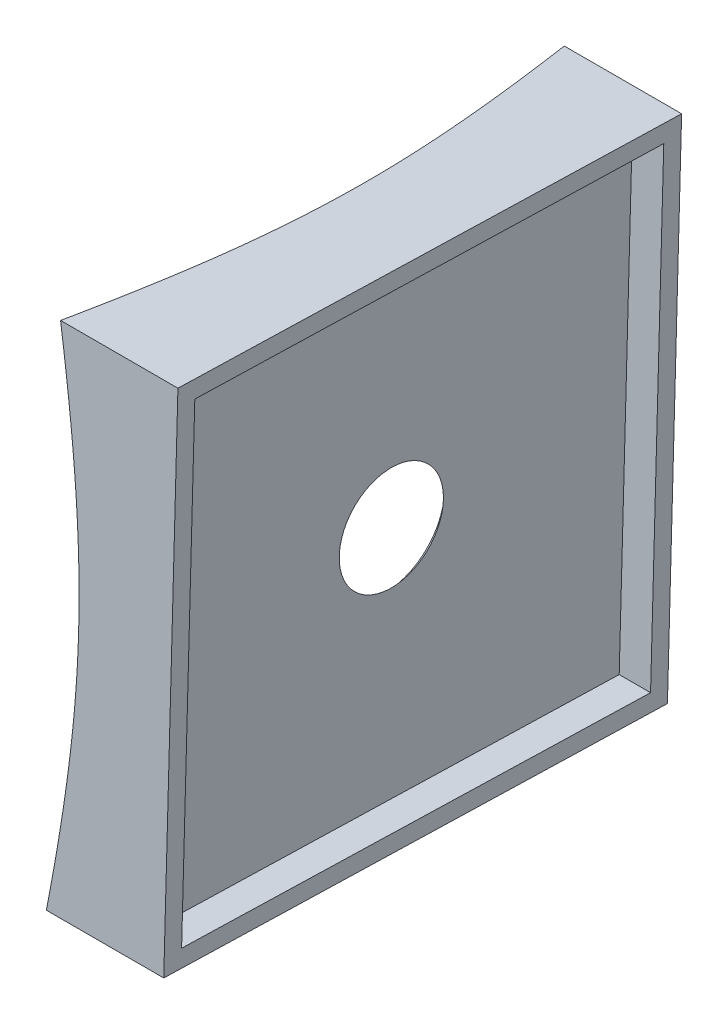
ISO-10303-21;
HEADER;
FILE_DESCRIPTION(('STEP AP214'),'2;1');
FILE_NAME('part.step','',(''),(''),'','','');
FILE_SCHEMA(('AUTOMOTIVE_DESIGN { 1 0 10303 214 1 1 1 1 }'));
ENDSEC;
DATA;
#1=APPLICATION_CONTEXT('core data for automotive mechanical design processes');
#2=APPLICATION_PROTOCOL_DEFINITION('international standard','automotive_design',2000,#1);
#3=PRODUCT_CONTEXT('',#1,'mechanical');
#4=PRODUCT('Part','Part','',(#3));
#5=PRODUCT_RELATED_PRODUCT_CATEGORY('part','',(#4));
#6=PRODUCT_DEFINITION_FORMATION('','',#4);
#7=PRODUCT_DEFINITION_CONTEXT('part definition',#1,'design');
#8=PRODUCT_DEFINITION('design','',#6,#7);
#9=PRODUCT_DEFINITION_SHAPE('','',#8);
#10=(LENGTH_UNIT() NAMED_UNIT(*) SI_UNIT(.MILLI.,.METRE.));
#11=(NAMED_UNIT(*) PLANE_ANGLE_UNIT() SI_UNIT($,.RADIAN.));
#12=(NAMED_UNIT(*) SI_UNIT($,.STERADIAN.) SOLID_ANGLE_UNIT());
#13=UNCERTAINTY_MEASURE_WITH_UNIT(LENGTH_MEASURE(1.E-05),#10,'distance_accuracy_value','');
#14=(GEOMETRIC_REPRESENTATION_CONTEXT(3) GLOBAL_UNCERTAINTY_ASSIGNED_CONTEXT((#13)) GLOBAL_UNIT_ASSIGNED_CONTEXT((#10,
#11,#12)) REPRESENTATION_CONTEXT('',''));
#15=CARTESIAN_POINT('',(0.,0.,0.));
#16=DIRECTION('',(0.,0.,1.));
#17=DIRECTION('',(1.,0.,0.));
#18=AXIS2_PLACEMENT_3D('',#15,#16,#17);
#19=CARTESIAN_POINT('',(-15.,0.,0.));
#20=DIRECTION('',(1.,0.,0.));
#21=DIRECTION('',(0.,0.,-1.));
#22=AXIS2_PLACEMENT_3D('',#19,#20,#21);
#23=PLANE('',#22);
#24=DIRECTION('',(0.,-0.999603331238634,0.0281634546287368));
#25=VECTOR('',#24,1.);
#26=CARTESIAN_POINT('',(-15.,-50.420133833359,8.76548214453563));
#27=LINE('',#26,#25);
#28=CARTESIAN_POINT('',(-15.,7.5568593784818,7.13200177606889));
#29=VERTEX_POINT('',#28);
#30=CARTESIAN_POINT('',(-15.,-50.420133833359,8.76548214453563));
#31=VERTEX_POINT('',#30);
#32=EDGE_CURVE('E131',#29,#31,#27,.T.);
#33=ORIENTED_EDGE('',*,*,#32,.T.);
#34=DIRECTION('',(0.,-0.0281634546287368,-0.999603331238634));
#35=VECTOR('',#34,1.);
#36=CARTESIAN_POINT('',(-15.,-52.0536142018258,-49.2115110673052));
#37=LINE('',#36,#35);
#38=CARTESIAN_POINT('',(-15.,-52.0536142018258,-49.2115110673052));
#39=VERTEX_POINT('',#38);
#40=EDGE_CURVE('E135',#31,#39,#37,.T.);
#41=ORIENTED_EDGE('',*,*,#40,.T.);
#42=DIRECTION('',(0.,0.999603331238634,-0.0281634546287367));
#43=VECTOR('',#42,1.);
#44=CARTESIAN_POINT('',(-15.,5.92337901001507,-50.8449914357719));
#45=LINE('',#44,#43);
#46=CARTESIAN_POINT('',(-15.,5.92337901001507,-50.8449914357719));
#47=VERTEX_POINT('',#46);
#48=EDGE_CURVE('E115',#39,#47,#45,.T.);
#49=ORIENTED_EDGE('',*,*,#48,.T.);
#50=DIRECTION('',(0.,0.0281634546287368,0.999603331238634));
#51=VECTOR('',#50,1.);
#52=CARTESIAN_POINT('',(-15.,7.5568593784818,7.13200177606889));
#53=LINE('',#52,#51);
#54=EDGE_CURVE('E125',#47,#29,#53,.T.);
#55=ORIENTED_EDGE('',*,*,#54,.T.);
#56=EDGE_LOOP('',(#33,#41,#49,#55));
#57=FACE_BOUND('',#56,.T.);
#58=DIRECTION('',(0.,0.0281634546287368,0.999603331238634));
#59=VECTOR('',#58,1.);
#60=CARTESIAN_POINT('',(-15.,5.50132580674706,5.1891220228491));
#61=LINE('',#60,#59);
#62=CARTESIAN_POINT('',(-15.,3.98049925679527,-48.7894578640372));
#63=VERTEX_POINT('',#62);
#64=CARTESIAN_POINT('',(-15.,5.50132580674706,5.1891220228491));
#65=VERTEX_POINT('',#64);
#66=EDGE_CURVE('E228',#63,#65,#61,.T.);
#67=ORIENTED_EDGE('',*,*,#66,.F.);
#68=DIRECTION('',(0.,0.999603331238634,-0.0281634546287368));
#69=VECTOR('',#68,1.);
#70=CARTESIAN_POINT('',(-15.,3.98049925679527,-48.7894578640372));
#71=LINE('',#70,#69);
#72=CARTESIAN_POINT('',(-15.,-49.998080630091,-47.2686313140854));
#73=VERTEX_POINT('',#72);
#74=EDGE_CURVE('E225',#73,#63,#71,.T.);
#75=ORIENTED_EDGE('',*,*,#74,.F.);
#76=DIRECTION('',(0.,-0.028163454628737,-0.999603331238634));
#77=VECTOR('',#76,1.);
#78=CARTESIAN_POINT('',(-15.,-49.998080630091,-47.2686313140854));
#79=LINE('',#78,#77);
#80=CARTESIAN_POINT('',(-15.,-48.4772540801392,6.70994857280088));
#81=VERTEX_POINT('',#80);
#82=EDGE_CURVE('E222',#81,#73,#79,.T.);
#83=ORIENTED_EDGE('',*,*,#82,.F.);
#84=DIRECTION('',(0.,-0.999603331238634,0.0281634546287368));
#85=VECTOR('',#84,1.);
#86=CARTESIAN_POINT('',(-15.,-48.4772540801392,6.70994857280088));
#87=LINE('',#86,#85);
#88=EDGE_CURVE('E219',#65,#81,#87,.T.);
#89=ORIENTED_EDGE('',*,*,#88,.F.);
#90=EDGE_LOOP('',(#67,#75,#83,#89));
#91=FACE_BOUND('',#90,.T.);
#92=ADVANCED_FACE('F45',(#57,#91),#23,.T.);
#93=CARTESIAN_POINT('',(-11.4581699793895,-22.248377411672,-21.0397546456181));
#94=DIRECTION('',(1.,0.,0.));
#95=DIRECTION('',(0.,0.,-1.));
#96=AXIS2_PLACEMENT_3D('',#93,#94,#95);
#97=TOROIDAL_SURFACE('',#96,12.9893724579747,10.);
#98=CARTESIAN_POINT('',(-18.61,-22.248377411672,-21.0397546456181));
#99=DIRECTION('',(1.,0.,0.));
#100=DIRECTION('',(0.,0.,-1.));
#101=AXIS2_PLACEMENT_3D('',#98,#99,#100);
#102=CIRCLE('',#101,6.);
#103=CARTESIAN_POINT('',(-18.61,-22.248377411672,-27.0397546456181));
#104=VERTEX_POINT('',#103);
#105=EDGE_CURVE('E181',#104,#104,#102,.T.);
#106=ORIENTED_EDGE('',*,*,#105,.T.);
#107=EDGE_LOOP('',(#106));
#108=FACE_BOUND('',#107,.T.);
#109=CARTESIAN_POINT('',(-21.1789920651224,-22.248377411672,-21.0397546456181));
#110=DIRECTION('',(-1.,0.,0.));
#111=DIRECTION('',(0.,0.,1.));
#112=AXIS2_PLACEMENT_3D('',#109,#110,#111);
#113=CIRCLE('',#112,10.6429671269357);
#114=CARTESIAN_POINT('',(-21.1789920651224,-22.248377411672,-10.3967875186824));
#115=VERTEX_POINT('',#114);
#116=EDGE_CURVE('E142',#115,#115,#113,.F.);
#117=ORIENTED_EDGE('',*,*,#116,.F.);
#118=EDGE_LOOP('',(#117));
#119=FACE_BOUND('',#118,.T.);
#120=ADVANCED_FACE('F250',(#108,#119),#97,.T.);
#121=CARTESIAN_POINT('',(-18.61,3.98049925679527,-48.7894578640372));
#122=DIRECTION('',(0.,0.0281634546287368,0.999603331238634));
#123=DIRECTION('',(0.,-0.999603331238634,0.0281634546287368));
#124=AXIS2_PLACEMENT_3D('',#121,#122,#123);
#125=PLANE('',#124);
#126=DIRECTION('',(1.,0.,0.));
#127=VECTOR('',#126,1.);
#128=CARTESIAN_POINT('',(-18.61,-49.998080630091,-47.2686313140854));
#129=LINE('',#128,#127);
#130=CARTESIAN_POINT('',(-18.61,-49.998080630091,-47.2686313140854));
#131=VERTEX_POINT('',#130);
#132=EDGE_CURVE('E151',#131,#73,#129,.T.);
#133=ORIENTED_EDGE('',*,*,#132,.T.);
#134=ORIENTED_EDGE('',*,*,#74,.T.);
#135=DIRECTION('',(1.,0.,0.));
#136=VECTOR('',#135,1.);
#137=CARTESIAN_POINT('',(-18.61,3.98049925679527,-48.7894578640372));
#138=LINE('',#137,#136);
#139=CARTESIAN_POINT('',(-18.61,3.98049925679527,-48.7894578640372));
#140=VERTEX_POINT('',#139);
#141=EDGE_CURVE('E147',#140,#63,#138,.T.);
#142=ORIENTED_EDGE('',*,*,#141,.F.);
#143=DIRECTION('',(0.,-0.999603331238634,0.0281634546287368));
#144=VECTOR('',#143,1.);
#145=CARTESIAN_POINT('',(-18.61,3.98049925679527,-48.7894578640372));
#146=LINE('',#145,#144);
#147=EDGE_CURVE('E170',#140,#131,#146,.T.);
#148=ORIENTED_EDGE('',*,*,#147,.T.);
#149=EDGE_LOOP('',(#133,#134,#142,#148));
#150=FACE_BOUND('',#149,.T.);
#151=ADVANCED_FACE('F252',(#150),#125,.T.);
#152=CARTESIAN_POINT('',(-18.61,-51.2368740175924,-20.2230144613848));
#153=DIRECTION('',(1.,0.,0.));
#154=DIRECTION('',(0.,0.,-1.));
#155=AXIS2_PLACEMENT_3D('',#152,#153,#154);
#156=PLANE('',#155);
#157=ORIENTED_EDGE('',*,*,#105,.F.);
#158=EDGE_LOOP('',(#157));
#159=FACE_BOUND('',#158,.T.);
#160=ORIENTED_EDGE('',*,*,#147,.F.);
#161=DIRECTION('',(0.,-0.0281634546287368,-0.999603331238634));
#162=VECTOR('',#161,1.);
#163=CARTESIAN_POINT('',(-18.61,5.50132580674706,5.1891220228491));
#164=LINE('',#163,#162);
#165=CARTESIAN_POINT('',(-18.61,5.50132580674706,5.1891220228491));
#166=VERTEX_POINT('',#165);
#167=EDGE_CURVE('E177',#166,#140,#164,.T.);
#168=ORIENTED_EDGE('',*,*,#167,.F.);
#169=DIRECTION('',(0.,0.999603331238634,-0.0281634546287368));
#170=VECTOR('',#169,1.);
#171=CARTESIAN_POINT('',(-18.61,-48.4772540801392,6.70994857280088));
#172=LINE('',#171,#170);
#173=CARTESIAN_POINT('',(-18.61,-48.4772540801392,6.70994857280088));
#174=VERTEX_POINT('',#173);
#175=EDGE_CURVE('E162',#174,#166,#172,.T.);
#176=ORIENTED_EDGE('',*,*,#175,.F.);
#177=DIRECTION('',(0.,0.028163454628737,0.999603331238634));
#178=VECTOR('',#177,1.);
#179=CARTESIAN_POINT('',(-18.61,-49.998080630091,-47.2686313140854));
#180=LINE('',#179,#178);
#181=EDGE_CURVE('E167',#131,#174,#180,.T.);
#182=ORIENTED_EDGE('',*,*,#181,.F.);
#183=EDGE_LOOP('',(#160,#168,#176,#182));
#184=FACE_BOUND('',#183,.T.);
#185=ADVANCED_FACE('F206',(#159,#184),#156,.T.);
#186=CARTESIAN_POINT('',(-18.61,-49.998080630091,-47.2686313140854));
#187=DIRECTION('',(0.,0.999603331238634,-0.028163454628737));
#188=DIRECTION('',(0.,0.028163454628737,0.999603331238634));
#189=AXIS2_PLACEMENT_3D('',#186,#187,#188);
#190=PLANE('',#189);
#191=DIRECTION('',(1.,0.,0.));
#192=VECTOR('',#191,1.);
#193=CARTESIAN_POINT('',(-18.61,-48.4772540801392,6.70994857280088));
#194=LINE('',#193,#192);
#195=EDGE_CURVE('E154',#174,#81,#194,.T.);
#196=ORIENTED_EDGE('',*,*,#195,.T.);
#197=ORIENTED_EDGE('',*,*,#82,.T.);
#198=ORIENTED_EDGE('',*,*,#132,.F.);
#199=ORIENTED_EDGE('',*,*,#181,.T.);
#200=EDGE_LOOP('',(#196,#197,#198,#199));
#201=FACE_BOUND('',#200,.T.);
#202=ADVANCED_FACE('F268',(#201),#190,.T.);
#203=CARTESIAN_POINT('',(-18.61,5.50132580674706,5.1891220228491));
#204=DIRECTION('',(0.,-0.999603331238634,0.0281634546287368));
#205=DIRECTION('',(0.,-0.0281634546287368,-0.999603331238634));
#206=AXIS2_PLACEMENT_3D('',#203,#204,#205);
#207=PLANE('',#206);
#208=ORIENTED_EDGE('',*,*,#141,.T.);
#209=ORIENTED_EDGE('',*,*,#66,.T.);
#210=DIRECTION('',(1.,0.,0.));
#211=VECTOR('',#210,1.);
#212=CARTESIAN_POINT('',(-18.61,5.50132580674706,5.1891220228491));
#213=LINE('',#212,#211);
#214=EDGE_CURVE('E49',#166,#65,#213,.T.);
#215=ORIENTED_EDGE('',*,*,#214,.F.);
#216=ORIENTED_EDGE('',*,*,#167,.T.);
#217=EDGE_LOOP('',(#208,#209,#215,#216));
#218=FACE_BOUND('',#217,.T.);
#219=ADVANCED_FACE('F272',(#218),#207,.T.);
#220=CARTESIAN_POINT('',(-18.61,-48.4772540801392,6.70994857280088));
#221=DIRECTION('',(0.,-0.0281634546287368,-0.999603331238634));
#222=DIRECTION('',(0.,0.999603331238634,-0.0281634546287368));
#223=AXIS2_PLACEMENT_3D('',#220,#221,#222);
#224=PLANE('',#223);
#225=ORIENTED_EDGE('',*,*,#214,.T.);
#226=ORIENTED_EDGE('',*,*,#88,.T.);
#227=ORIENTED_EDGE('',*,*,#195,.F.);
#228=ORIENTED_EDGE('',*,*,#175,.T.);
#229=EDGE_LOOP('',(#225,#226,#227,#228));
#230=FACE_BOUND('',#229,.T.);
#231=ADVANCED_FACE('F47',(#230),#224,.T.);
#232=CARTESIAN_POINT('',(-18.61,-50.420133833359,8.76548214453563));
#233=DIRECTION('',(0.,-0.0281634546287368,-0.999603331238634));
#234=DIRECTION('',(0.,0.999603331238634,-0.0281634546287368));
#235=AXIS2_PLACEMENT_3D('',#232,#233,#234);
#236=PLANE('',#235);
#237=ORIENTED_EDGE('',*,*,#32,.F.);
#238=DIRECTION('',(1.,0.,0.));
#239=VECTOR('',#238,1.);
#240=CARTESIAN_POINT('',(-18.61,7.5568593784818,7.13200177606889));
#241=LINE('',#240,#239);
#242=CARTESIAN_POINT('',(-28.5094949366117,7.5568593784818,7.13200177606889));
#243=VERTEX_POINT('',#242);
#244=EDGE_CURVE('E122',#243,#29,#241,.T.);
#245=ORIENTED_EDGE('',*,*,#244,.F.);
#246=CARTESIAN_POINT('',(-28.5095290864061,-50.420333833359,8.76548777946175));
#247=CARTESIAN_POINT('',(-28.3615120189373,-49.5533192105682,8.74105996271852));
#248=CARTESIAN_POINT('',(-28.2166725597,-48.6857525699901,8.71661659307804));
#249=CARTESIAN_POINT('',(-27.9344218695929,-46.9493810106497,8.66769496576661));
#250=CARTESIAN_POINT('',(-27.7970109167125,-46.0805760467939,8.64321670682519));
#251=CARTESIAN_POINT('',(-27.5306322784443,-44.3412065444453,8.59421061357687));
#252=CARTESIAN_POINT('',(-27.4016690184003,-43.4706413261291,8.56968276011622));
#253=CARTESIAN_POINT('',(-27.1535275015908,-41.7281219349922,8.52058791991479));
#254=CARTESIAN_POINT('',(-27.034349156175,-40.8561677748282,8.49602093353061));
#255=CARTESIAN_POINT('',(-26.8070554140274,-39.1099534307571,8.44682198939508));
#256=CARTESIAN_POINT('',(-26.6989508607805,-38.2356918304129,8.42218999173614));
#257=CARTESIAN_POINT('',(-26.4954430895225,-36.4856747589599,8.37288390716127));
#258=CARTESIAN_POINT('',(-26.4000400225253,-35.609919270215,8.34820981974844));
#259=CARTESIAN_POINT('',(-26.2235172089076,-33.8570926198621,8.29882457632585));
#260=CARTESIAN_POINT('',(-26.1423953660181,-32.9800216704369,8.27411342629425));
#261=CARTESIAN_POINT('',(-25.9959661704289,-31.2245756977996,8.22465438443381));
#262=CARTESIAN_POINT('',(-25.9306584035643,-30.3462007093461,8.19990649358427));
#263=CARTESIAN_POINT('',(-25.8179691541409,-28.5991859282428,8.15068499743102));
#264=CARTESIAN_POINT('',(-25.7703762731965,-27.7305598556457,8.12621177868473));
#265=CARTESIAN_POINT('',(-25.6931071834216,-25.9925067195989,8.07724277357074));
#266=CARTESIAN_POINT('',(-25.6634309447749,-25.1230796574847,8.05274698724067));
#267=CARTESIAN_POINT('',(-25.6227405676756,-23.3837759019233,8.0037427463838));
#268=CARTESIAN_POINT('',(-25.611726637473,-22.5138992035671,7.9792342917187));
#269=CARTESIAN_POINT('',(-25.6086490462998,-20.774112940722,7.93021645639734));
#270=CARTESIAN_POINT('',(-25.616585364688,-19.90420337627,7.90570707574212));
#271=CARTESIAN_POINT('',(-25.6511860596537,-18.1654805771054,7.85671920311714));
#272=CARTESIAN_POINT('',(-25.6778349183791,-17.2966670311303,7.83224070237767));
#273=CARTESIAN_POINT('',(-25.7491698861546,-15.5597813464223,7.78330458977393));
#274=CARTESIAN_POINT('',(-25.7938560930921,-14.6917092117386,7.75884697802373));
#275=CARTESIAN_POINT('',(-25.9002067407894,-12.956622360095,7.70996154687713));
#276=CARTESIAN_POINT('',(-25.961870998212,-12.0896076318182,7.68553372716187));
#277=CARTESIAN_POINT('',(-26.1008527747968,-10.3568322122462,7.63671341976009));
#278=CARTESIAN_POINT('',(-26.1781704302152,-9.49107153193292,7.61232093238299));
#279=CARTESIAN_POINT('',(-26.3285324181474,-7.95006618876275,7.56890367604869));
#280=CARTESIAN_POINT('',(-26.3988156007163,-7.27454974925753,7.5498712498848));
#281=CARTESIAN_POINT('',(-26.5473173293966,-5.92443325905969,7.51183221647334));
#282=CARTESIAN_POINT('',(-26.625535405659,-5.24983315650227,7.49282560776449));
#283=CARTESIAN_POINT('',(-26.8710401613971,-3.22719997339546,7.43583866494146));
#284=CARTESIAN_POINT('',(-27.0491636728229,-1.88047138809848,7.39789508449917));
#285=CARTESIAN_POINT('',(-27.3345557694149,0.140619093372598,7.34095160672489));
#286=CARTESIAN_POINT('',(-27.4330029283504,0.816253373573036,7.32191586044295));
#287=CARTESIAN_POINT('',(-27.6352741600994,2.16671936948047,7.28386697983721));
#288=CARTESIAN_POINT('',(-27.739098225591,2.84155108627906,7.26485384548267));
#289=CARTESIAN_POINT('',(-27.9515363580887,4.19024344984259,7.22685493631309));
#290=CARTESIAN_POINT('',(-28.0601489294023,4.86410433288063,7.20786915484115));
#291=CARTESIAN_POINT('',(-28.2817087806571,6.21110705670203,7.16991785064719));
#292=CARTESIAN_POINT('',(-28.3946560157991,6.88424890484283,7.15095232771789));
#293=CARTESIAN_POINT('',(-28.5095290864061,7.55705937848181,7.13199614114277));
#294=B_SPLINE_CURVE_WITH_KNOTS('',3,(#246,#247,#248,#249,#250,#251,#252,#253,#254,#255,#256,
#257,#258,#259,#260,#261,#262,#263,#264,#265,#266,#267,#268,#269,#270,#271,#272,#273,#274,#275,
#276,#277,#278,#279,#280,#281,#282,#283,#284,#285,#286,#287,#288,#289,#290,#291,#292,#293),
.UNSPECIFIED.,.F.,.F.,(4,2,2,2,2,2,2,2,2,2,2,2,2,2,2,2,2,2,2,2,2,2,2,4),(0.,2.63970211740469,
5.2795029493581,7.92067576715604,10.5618246535933,13.205535522218,15.8492778203558,
18.4926317327186,21.1359164091373,23.7465614329058,26.357202112124,28.9678719228976,
31.5785388900533,34.1870434478219,36.7955621619664,39.4040527091926,42.0125659631853,
44.0508052270482,46.0889238709622,50.1655753856931,52.2146650704377,54.2637519649559,
56.3122032987129,58.3606334672046),.UNSPECIFIED.);
#295=CARTESIAN_POINT('',(-28.5094949366117,-50.420133833359,8.76548214453563));
#296=VERTEX_POINT('',#295);
#297=EDGE_CURVE('E11',#296,#243,#294,.T.);
#298=ORIENTED_EDGE('',*,*,#297,.F.);
#299=DIRECTION('',(1.,0.,0.));
#300=VECTOR('',#299,1.);
#301=CARTESIAN_POINT('',(-18.61,-50.420133833359,8.76548214453563));
#302=LINE('',#301,#300);
#303=EDGE_CURVE('E63',#296,#31,#302,.T.);
#304=ORIENTED_EDGE('',*,*,#303,.T.);
#305=EDGE_LOOP('',(#237,#245,#298,#304));
#306=FACE_BOUND('',#305,.T.);
#307=ADVANCED_FACE('F235',(#306),#236,.F.);
#308=CARTESIAN_POINT('',(-18.61,7.5568593784818,7.13200177606889));
#309=DIRECTION('',(0.,-0.999603331238634,0.0281634546287368));
#310=DIRECTION('',(0.,-0.0281634546287368,-0.999603331238634));
#311=AXIS2_PLACEMENT_3D('',#308,#309,#310);
#312=PLANE('',#311);
#313=ORIENTED_EDGE('',*,*,#54,.F.);
#314=DIRECTION('',(1.,0.,0.));
#315=VECTOR('',#314,1.);
#316=CARTESIAN_POINT('',(-18.61,5.92337901001507,-50.8449914357719));
#317=LINE('',#316,#315);
#318=CARTESIAN_POINT('',(-28.5094949366117,5.92337901001507,-50.8449914357719));
#319=VERTEX_POINT('',#318);
#320=EDGE_CURVE('E111',#319,#47,#317,.T.);
#321=ORIENTED_EDGE('',*,*,#320,.F.);
#322=CARTESIAN_POINT('',(-28.5095290864061,7.55686501340793,7.13220177606889));
#323=CARTESIAN_POINT('',(-28.3615120189373,7.5324371966647,6.26518715327807));
#324=CARTESIAN_POINT('',(-28.2166725597,7.50799382702421,5.39762051269999));
#325=CARTESIAN_POINT('',(-27.9344218695929,7.45907219971279,3.6612489533596));
#326=CARTESIAN_POINT('',(-27.7970109167125,7.43459394077136,2.79244398950379));
#327=CARTESIAN_POINT('',(-27.5306322784443,7.38558784752305,1.0530744871552));
#328=CARTESIAN_POINT('',(-27.4016690184003,7.36105999406239,0.182509268838954));
#329=CARTESIAN_POINT('',(-27.1535275015908,7.31196515386096,-1.56001012229793));
#330=CARTESIAN_POINT('',(-27.034349156175,7.28739816747679,-2.43196428246194));
#331=CARTESIAN_POINT('',(-26.8070554140274,7.23819922334126,-4.17817862653304));
#332=CARTESIAN_POINT('',(-26.6989508607805,7.21356722568232,-5.05244022687725));
#333=CARTESIAN_POINT('',(-26.4954430895225,7.16426114110744,-6.80245729833022));
#334=CARTESIAN_POINT('',(-26.4000400225253,7.13958705369461,-7.67821278707517));
#335=CARTESIAN_POINT('',(-26.2235172089076,7.09020181027202,-9.431039437428));
#336=CARTESIAN_POINT('',(-26.1423953660182,7.06549066024043,-10.3081103868532));
#337=CARTESIAN_POINT('',(-25.9959661704289,7.01603161837999,-12.0635563594905));
#338=CARTESIAN_POINT('',(-25.9306584035643,6.99128372753045,-12.941931347944));
#339=CARTESIAN_POINT('',(-25.8179691541409,6.9420622313772,-14.6889461290473));
#340=CARTESIAN_POINT('',(-25.7703762731965,6.91758901263091,-15.5575722016444));
#341=CARTESIAN_POINT('',(-25.6931071834216,6.86862000751692,-17.2956253376912));
#342=CARTESIAN_POINT('',(-25.6634309447749,6.84412422118684,-18.1650523998055));
#343=CARTESIAN_POINT('',(-25.6227405676756,6.79511998032998,-19.9043561553668));
#344=CARTESIAN_POINT('',(-25.611726637473,6.77061152566487,-20.774232853723));
#345=CARTESIAN_POINT('',(-25.6086490462998,6.72159369034351,-22.5140191165681));
#346=CARTESIAN_POINT('',(-25.616585364688,6.6970843096883,-23.3839286810201));
#347=CARTESIAN_POINT('',(-25.6511860596537,6.64809643706332,-25.1226514801848));
#348=CARTESIAN_POINT('',(-25.6778349183791,6.62361793632385,-25.9914650261598));
#349=CARTESIAN_POINT('',(-25.7491698861546,6.5746818237201,-27.7283507108678));
#350=CARTESIAN_POINT('',(-25.7938560930921,6.55022421196991,-28.5964228455515));
#351=CARTESIAN_POINT('',(-25.9002067407894,6.5013387808233,-30.3315096971951));
#352=CARTESIAN_POINT('',(-25.961870998212,6.47691096110804,-31.1985244254719));
#353=CARTESIAN_POINT('',(-26.1008527747968,6.42809065370627,-32.931299845044));
#354=CARTESIAN_POINT('',(-26.1781704302152,6.40369816632917,-33.7970605253572));
#355=CARTESIAN_POINT('',(-26.3285324181474,6.36028090999486,-35.3380658685274));
#356=CARTESIAN_POINT('',(-26.3988156007163,6.34124848383098,-36.0135823080326));
#357=CARTESIAN_POINT('',(-26.5473173293966,6.30320945041952,-37.3636987982304));
#358=CARTESIAN_POINT('',(-26.625535405659,6.28420284171066,-38.0382989007878));
#359=CARTESIAN_POINT('',(-26.8710401613971,6.22721589888763,-40.0609320838947));
#360=CARTESIAN_POINT('',(-27.0491636728229,6.18927231844534,-41.4076606691916));
#361=CARTESIAN_POINT('',(-27.3345557694149,6.13232884067107,-43.4287511506627));
#362=CARTESIAN_POINT('',(-27.4330029283504,6.11329309438912,-44.1043854308631));
#363=CARTESIAN_POINT('',(-27.6352741600994,6.07524421378339,-45.4548514267706));
#364=CARTESIAN_POINT('',(-27.739098225591,6.05623107942885,-46.1296831435692));
#365=CARTESIAN_POINT('',(-27.9515363580887,6.01823217025927,-47.4783755071327));
#366=CARTESIAN_POINT('',(-28.0601489294023,5.99924638878733,-48.1522363901707));
#367=CARTESIAN_POINT('',(-28.2817087806571,5.96129508459337,-49.4992391139921));
#368=CARTESIAN_POINT('',(-28.3946560157991,5.94232956166406,-50.1723809621329));
#369=CARTESIAN_POINT('',(-28.5095290864061,5.92337337508894,-50.8451914357719));
#370=B_SPLINE_CURVE_WITH_KNOTS('',3,(#322,#323,#324,#325,#326,#327,#328,#329,#330,#331,#332,
#333,#334,#335,#336,#337,#338,#339,#340,#341,#342,#343,#344,#345,#346,#347,#348,#349,#350,#351,
#352,#353,#354,#355,#356,#357,#358,#359,#360,#361,#362,#363,#364,#365,#366,#367,#368,#369),
.UNSPECIFIED.,.F.,.F.,(4,2,2,2,2,2,2,2,2,2,2,2,2,2,2,2,2,2,2,2,2,2,2,4),(0.,2.63970211740469,
5.2795029493581,7.92067576715604,10.5618246535933,13.205535522218,15.8492778203558,
18.4926317327186,21.1359164091373,23.7465614329058,26.357202112124,28.9678719228976,
31.5785388900533,34.1870434478219,36.7955621619664,39.4040527091926,42.0125659631852,
44.0508052270482,46.0889238709622,50.1655753856931,52.2146650704377,54.2637519649559,
56.3122032987128,58.3606334672046),.UNSPECIFIED.);
#371=EDGE_CURVE('E185',#243,#319,#370,.T.);
#372=ORIENTED_EDGE('',*,*,#371,.F.);
#373=ORIENTED_EDGE('',*,*,#244,.T.);
#374=EDGE_LOOP('',(#313,#321,#372,#373));
#375=FACE_BOUND('',#374,.T.);
#376=ADVANCED_FACE('F126',(#375),#312,.F.);
#377=CARTESIAN_POINT('',(-25.61,-22.248377411672,-21.0397546456181));
#378=DIRECTION('',(-1.,0.,0.));
#379=DIRECTION('',(0.,0.,1.));
#380=AXIS2_PLACEMENT_3D('',#377,#378,#379);
#381=CONICAL_SURFACE('',#380,29.,1.33394756584798);
#382=ORIENTED_EDGE('',*,*,#116,.T.);
#383=EDGE_LOOP('',(#382));
#384=FACE_BOUND('',#383,.T.);
#385=ORIENTED_EDGE('',*,*,#297,.T.);
#386=ORIENTED_EDGE('',*,*,#371,.T.);
#387=CARTESIAN_POINT('',(-28.5095290864061,5.92357901001507,-50.844997070698));
#388=CARTESIAN_POINT('',(-28.3615120189373,5.05656438722425,-50.8205692539548));
#389=CARTESIAN_POINT('',(-28.2166725597,4.18899774664617,-50.7961258843143));
#390=CARTESIAN_POINT('',(-27.9344218695929,2.45262618730578,-50.7472042570029));
#391=CARTESIAN_POINT('',(-27.7970109167125,1.58382122344997,-50.7227259980615));
#392=CARTESIAN_POINT('',(-27.5306322784443,-0.155548278898622,-50.6737199048131));
#393=CARTESIAN_POINT('',(-27.4016690184003,-1.02611349721487,-50.6491920513525));
#394=CARTESIAN_POINT('',(-27.1535275015908,-2.76863288835175,-50.6000972111511));
#395=CARTESIAN_POINT('',(-27.034349156175,-3.64058704851576,-50.5755302247669));
#396=CARTESIAN_POINT('',(-26.8070554140274,-5.38680139258686,-50.5263312806314));
#397=CARTESIAN_POINT('',(-26.6989508607805,-6.26106299293107,-50.5016992829724));
#398=CARTESIAN_POINT('',(-26.4954430895225,-8.01108006438404,-50.4523931983975));
#399=CARTESIAN_POINT('',(-26.4000400225253,-8.88683555312898,-50.4277191109847));
#400=CARTESIAN_POINT('',(-26.2235172089076,-10.6396622034818,-50.3783338675621));
#401=CARTESIAN_POINT('',(-26.1423953660181,-11.516733152907,-50.3536227175305));
#402=CARTESIAN_POINT('',(-25.9959661704289,-13.2721791255443,-50.3041636756701));
#403=CARTESIAN_POINT('',(-25.9306584035643,-14.1505541139978,-50.2794157848206));
#404=CARTESIAN_POINT('',(-25.8179691541409,-15.8975688951011,-50.2301942886673));
#405=CARTESIAN_POINT('',(-25.7703762731965,-16.7661949676982,-50.205721069921));
#406=CARTESIAN_POINT('',(-25.6931071834216,-18.504248103745,-50.156752064807));
#407=CARTESIAN_POINT('',(-25.6634309447749,-19.3736751658593,-50.132256278477));
#408=CARTESIAN_POINT('',(-25.6227405676756,-21.1129789214207,-50.0832520376201));
#409=CARTESIAN_POINT('',(-25.611726637473,-21.9828556197768,-50.058743582955));
#410=CARTESIAN_POINT('',(-25.6086490462998,-23.7226418826219,-50.0097257476336));
#411=CARTESIAN_POINT('',(-25.616585364688,-24.5925514470739,-49.9852163669784));
#412=CARTESIAN_POINT('',(-25.6511860596537,-26.3312742462386,-49.9362284943534));
#413=CARTESIAN_POINT('',(-25.6778349183791,-27.2000877922136,-49.911749993614));
#414=CARTESIAN_POINT('',(-25.7491698861546,-28.9369734769216,-49.8628138810102));
#415=CARTESIAN_POINT('',(-25.7938560930921,-29.8050456116053,-49.83835626926));
#416=CARTESIAN_POINT('',(-25.9002067407894,-31.5401324632489,-49.7894708381134));
#417=CARTESIAN_POINT('',(-25.961870998212,-32.4071471915257,-49.7650430183981));
#418=CARTESIAN_POINT('',(-26.1008527747968,-34.1399226110978,-49.7162227109964));
#419=CARTESIAN_POINT('',(-26.1781704302152,-35.005683291411,-49.6918302236193));
#420=CARTESIAN_POINT('',(-26.3285324181474,-36.5466886345812,-49.648412967285));
#421=CARTESIAN_POINT('',(-26.3988156007163,-37.2222050740864,-49.6293805411211));
#422=CARTESIAN_POINT('',(-26.5473173293966,-38.5723215642843,-49.5913415077096));
#423=CARTESIAN_POINT('',(-26.625535405659,-39.2469216668417,-49.5723348990008));
#424=CARTESIAN_POINT('',(-26.8710401613971,-41.2695548499485,-49.5153479561777));
#425=CARTESIAN_POINT('',(-27.0491636728229,-42.6162834352455,-49.4774043757355));
#426=CARTESIAN_POINT('',(-27.3345557694149,-44.6373739167165,-49.4204608979612));
#427=CARTESIAN_POINT('',(-27.4330029283504,-45.313008196917,-49.4014251516792));
#428=CARTESIAN_POINT('',(-27.6352741600994,-46.6634741928244,-49.3633762710735));
#429=CARTESIAN_POINT('',(-27.739098225591,-47.338305909623,-49.344363136719));
#430=CARTESIAN_POINT('',(-27.9515363580887,-48.6869982731865,-49.3063642275494));
#431=CARTESIAN_POINT('',(-28.0601489294023,-49.3608591562246,-49.2873784460774));
#432=CARTESIAN_POINT('',(-28.2817087806571,-50.707861880046,-49.2494271418835));
#433=CARTESIAN_POINT('',(-28.3946560157991,-51.3810037281868,-49.2304616189542));
#434=CARTESIAN_POINT('',(-28.5095290864061,-52.0538142018258,-49.211505432379));
#435=B_SPLINE_CURVE_WITH_KNOTS('',3,(#387,#388,#389,#390,#391,#392,#393,#394,#395,#396,#397,
#398,#399,#400,#401,#402,#403,#404,#405,#406,#407,#408,#409,#410,#411,#412,#413,#414,#415,#416,
#417,#418,#419,#420,#421,#422,#423,#424,#425,#426,#427,#428,#429,#430,#431,#432,#433,#434),
.UNSPECIFIED.,.F.,.F.,(4,2,2,2,2,2,2,2,2,2,2,2,2,2,2,2,2,2,2,2,2,2,2,4),(0.,2.63970211740469,
5.2795029493581,7.92067576715603,10.5618246535933,13.205535522218,15.8492778203558,
18.4926317327186,21.1359164091373,23.7465614329058,26.357202112124,28.9678719228976,
31.5785388900533,34.1870434478218,36.7955621619664,39.4040527091926,42.0125659631852,
44.0508052270482,46.0889238709622,50.1655753856931,52.2146650704377,54.2637519649559,
56.3122032987129,58.3606334672046),.UNSPECIFIED.);
#436=CARTESIAN_POINT('',(-28.5094949366117,-52.0536142018258,-49.2115110673052));
#437=VERTEX_POINT('',#436);
#438=EDGE_CURVE('E117',#319,#437,#435,.T.);
#439=ORIENTED_EDGE('',*,*,#438,.T.);
#440=CARTESIAN_POINT('',(-28.5095290864061,-52.0536198367519,-49.2117110673052));
#441=CARTESIAN_POINT('',(-28.3615120189373,-52.0291920200087,-48.3446964445144));
#442=CARTESIAN_POINT('',(-28.2166725597,-52.0047486503682,-47.4771298039363));
#443=CARTESIAN_POINT('',(-27.9344218695929,-51.9558270230567,-45.7407582445959));
#444=CARTESIAN_POINT('',(-27.7970109167125,-51.9313487641153,-44.8719532807401));
#445=CARTESIAN_POINT('',(-27.5306322784443,-51.882342670867,-43.1325837783915));
#446=CARTESIAN_POINT('',(-27.4016690184003,-51.8578148174063,-42.2620185600752));
#447=CARTESIAN_POINT('',(-27.1535275015908,-51.8087199772049,-40.5194991689384));
#448=CARTESIAN_POINT('',(-27.034349156175,-51.7841529908207,-39.6475450087743));
#449=CARTESIAN_POINT('',(-26.8070554140274,-51.7349540466852,-37.9013306647032));
#450=CARTESIAN_POINT('',(-26.6989508607805,-51.7103220490263,-37.027069064359));
#451=CARTESIAN_POINT('',(-26.4954430895225,-51.6610159644514,-35.2770519929061));
#452=CARTESIAN_POINT('',(-26.4000400225253,-51.6363418770386,-34.4012965041611));
#453=CARTESIAN_POINT('',(-26.2235172089076,-51.586956633616,-32.6484698538083));
#454=CARTESIAN_POINT('',(-26.1423953660181,-51.5622454835844,-31.7713989043831));
#455=CARTESIAN_POINT('',(-25.9959661704289,-51.5127864417239,-30.0159529317458));
#456=CARTESIAN_POINT('',(-25.9306584035643,-51.4880385508744,-29.1375779432923));
#457=CARTESIAN_POINT('',(-25.8179691541409,-51.4388170547211,-27.390563162189));
#458=CARTESIAN_POINT('',(-25.7703762731965,-51.4143438359749,-26.5219370895919));
#459=CARTESIAN_POINT('',(-25.6931071834216,-51.3653748308609,-24.7838839535451));
#460=CARTESIAN_POINT('',(-25.6634309447749,-51.3408790445308,-23.9144568914308));
#461=CARTESIAN_POINT('',(-25.6227405676756,-51.2918748036739,-22.1751531358694));
#462=CARTESIAN_POINT('',(-25.611726637473,-51.2673663490088,-21.3052764375133));
#463=CARTESIAN_POINT('',(-25.6086490462998,-51.2183485136875,-19.5654901746682));
#464=CARTESIAN_POINT('',(-25.616585364688,-51.1938391330322,-18.6955806102162));
#465=CARTESIAN_POINT('',(-25.6511860596537,-51.1448512604073,-16.9568578110515));
#466=CARTESIAN_POINT('',(-25.6778349183791,-51.1203727596678,-16.0880442650765));
#467=CARTESIAN_POINT('',(-25.7491698861546,-51.0714366470641,-14.3511585803685));
#468=CARTESIAN_POINT('',(-25.7938560930921,-51.0469790353139,-13.4830864456848));
#469=CARTESIAN_POINT('',(-25.9002067407894,-50.9980936041673,-11.7479995940412));
#470=CARTESIAN_POINT('',(-25.961870998212,-50.973665784452,-10.8809848657644));
#471=CARTESIAN_POINT('',(-26.1008527747968,-50.9248454770502,-9.14820944619234));
#472=CARTESIAN_POINT('',(-26.1781704302152,-50.9004529896731,-8.28244876587909));
#473=CARTESIAN_POINT('',(-26.3285324181474,-50.8570357333388,-6.74144342270892));
#474=CARTESIAN_POINT('',(-26.3988156007163,-50.8380033071749,-6.0659269832037));
#475=CARTESIAN_POINT('',(-26.5473173293966,-50.7999642737635,-4.71581049300585));
#476=CARTESIAN_POINT('',(-26.625535405659,-50.7809576650546,-4.04121039044844));
#477=CARTESIAN_POINT('',(-26.8710401613971,-50.7239707222316,-2.01857720734163));
#478=CARTESIAN_POINT('',(-27.0491636728229,-50.6860271417893,-0.671848622044654));
#479=CARTESIAN_POINT('',(-27.3345557694149,-50.629083664015,1.34924185942642));
#480=CARTESIAN_POINT('',(-27.4330029283504,-50.6100479177331,2.02487613962686));
#481=CARTESIAN_POINT('',(-27.6352741600994,-50.5719990371273,3.37534213553429));
#482=CARTESIAN_POINT('',(-27.739098225591,-50.5529859027728,4.05017385233288));
#483=CARTESIAN_POINT('',(-27.9515363580887,-50.5149869936032,5.39886621589641));
#484=CARTESIAN_POINT('',(-28.0601489294023,-50.4960012121313,6.07272709893445));
#485=CARTESIAN_POINT('',(-28.2817087806571,-50.4580499079373,7.41972982275585));
#486=CARTESIAN_POINT('',(-28.3946560157991,-50.439084385008,8.09287167089666));
#487=CARTESIAN_POINT('',(-28.5095290864061,-50.4201281984329,8.76568214453563));
#488=B_SPLINE_CURVE_WITH_KNOTS('',3,(#440,#441,#442,#443,#444,#445,#446,#447,#448,#449,#450,
#451,#452,#453,#454,#455,#456,#457,#458,#459,#460,#461,#462,#463,#464,#465,#466,#467,#468,#469,
#470,#471,#472,#473,#474,#475,#476,#477,#478,#479,#480,#481,#482,#483,#484,#485,#486,#487),
.UNSPECIFIED.,.F.,.F.,(4,2,2,2,2,2,2,2,2,2,2,2,2,2,2,2,2,2,2,2,2,2,2,4),(0.,2.63970211740469,
5.2795029493581,7.92067576715603,10.5618246535933,13.205535522218,15.8492778203558,
18.4926317327186,21.1359164091373,23.7465614329058,26.357202112124,28.9678719228976,
31.5785388900533,34.1870434478218,36.7955621619664,39.4040527091926,42.0125659631852,
44.0508052270482,46.0889238709622,50.1655753856931,52.2146650704377,54.2637519649559,
56.3122032987129,58.3606334672046),.UNSPECIFIED.);
#489=EDGE_CURVE('E55',#437,#296,#488,.T.);
#490=ORIENTED_EDGE('',*,*,#489,.T.);
#491=EDGE_LOOP('',(#385,#386,#439,#490));
#492=FACE_BOUND('',#491,.T.);
#493=ADVANCED_FACE('F200',(#384,#492),#381,.F.);
#494=CARTESIAN_POINT('',(-18.61,-52.0536142018258,-49.2115110673052));
#495=DIRECTION('',(0.,0.999603331238634,-0.0281634546287368));
#496=DIRECTION('',(0.,0.0281634546287368,0.999603331238634));
#497=AXIS2_PLACEMENT_3D('',#494,#495,#496);
#498=PLANE('',#497);
#499=ORIENTED_EDGE('',*,*,#40,.F.);
#500=ORIENTED_EDGE('',*,*,#303,.F.);
#501=ORIENTED_EDGE('',*,*,#489,.F.);
#502=DIRECTION('',(1.,0.,0.));
#503=VECTOR('',#502,1.);
#504=CARTESIAN_POINT('',(-18.61,-52.0536142018258,-49.2115110673052));
#505=LINE('',#504,#503);
#506=EDGE_CURVE('E71',#437,#39,#505,.T.);
#507=ORIENTED_EDGE('',*,*,#506,.T.);
#508=EDGE_LOOP('',(#499,#500,#501,#507));
#509=FACE_BOUND('',#508,.T.);
#510=ADVANCED_FACE('F237',(#509),#498,.F.);
#511=CARTESIAN_POINT('',(-18.61,5.92337901001507,-50.8449914357719));
#512=DIRECTION('',(0.,0.0281634546287367,0.999603331238634));
#513=DIRECTION('',(0.,-0.999603331238634,0.0281634546287367));
#514=AXIS2_PLACEMENT_3D('',#511,#512,#513);
#515=PLANE('',#514);
#516=ORIENTED_EDGE('',*,*,#48,.F.);
#517=ORIENTED_EDGE('',*,*,#506,.F.);
#518=ORIENTED_EDGE('',*,*,#438,.F.);
#519=ORIENTED_EDGE('',*,*,#320,.T.);
#520=EDGE_LOOP('',(#516,#517,#518,#519));
#521=FACE_BOUND('',#520,.T.);
#522=ADVANCED_FACE('F113',(#521),#515,.F.);
#523=CLOSED_SHELL('',(#92,#120,#151,#185,#202,#219,#231,#307,#376,#493,#510,#522));
#524=MANIFOLD_SOLID_BREP('B2',#523);
#525=ADVANCED_BREP_SHAPE_REPRESENTATION('',(#18,#524),#14);
#526=SHAPE_DEFINITION_REPRESENTATION(#9,#525);
ENDSEC;
END-ISO-10303-21;
